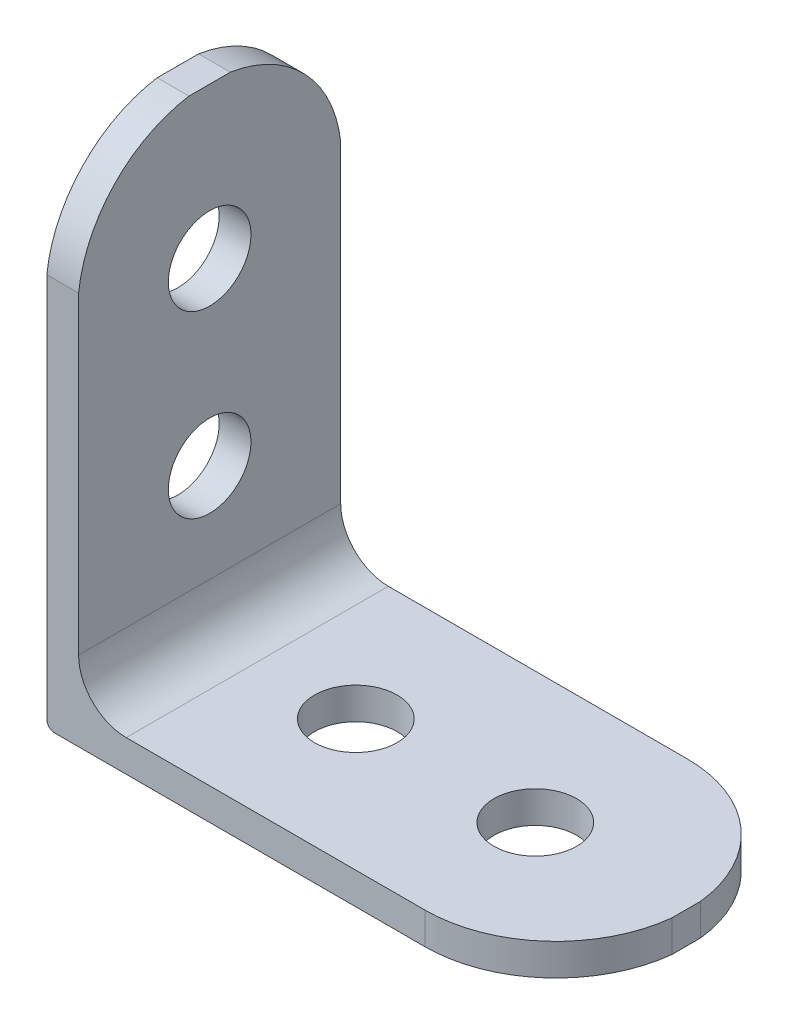
ISO-10303-21;
HEADER;
FILE_DESCRIPTION(('STEP AP214'),'2;1');
FILE_NAME('part.step','',(''),(''),'','','');
FILE_SCHEMA(('AUTOMOTIVE_DESIGN { 1 0 10303 214 1 1 1 1 }'));
ENDSEC;
DATA;
#1=APPLICATION_CONTEXT('core data for automotive mechanical design processes');
#2=APPLICATION_PROTOCOL_DEFINITION('international standard','automotive_design',2000,#1);
#3=PRODUCT_CONTEXT('',#1,'mechanical');
#4=PRODUCT('Part','Part','',(#3));
#5=PRODUCT_RELATED_PRODUCT_CATEGORY('part','',(#4));
#6=PRODUCT_DEFINITION_FORMATION('','',#4);
#7=PRODUCT_DEFINITION_CONTEXT('part definition',#1,'design');
#8=PRODUCT_DEFINITION('design','',#6,#7);
#9=PRODUCT_DEFINITION_SHAPE('','',#8);
#10=(LENGTH_UNIT() NAMED_UNIT(*) SI_UNIT(.MILLI.,.METRE.));
#11=(NAMED_UNIT(*) PLANE_ANGLE_UNIT() SI_UNIT($,.RADIAN.));
#12=(NAMED_UNIT(*) SI_UNIT($,.STERADIAN.) SOLID_ANGLE_UNIT());
#13=UNCERTAINTY_MEASURE_WITH_UNIT(LENGTH_MEASURE(1.E-05),#10,'distance_accuracy_value','');
#14=(GEOMETRIC_REPRESENTATION_CONTEXT(3) GLOBAL_UNCERTAINTY_ASSIGNED_CONTEXT((#13)) GLOBAL_UNIT_ASSIGNED_CONTEXT((#10,
#11,#12)) REPRESENTATION_CONTEXT('',''));
#15=CARTESIAN_POINT('',(0.,0.,0.));
#16=DIRECTION('',(0.,0.,1.));
#17=DIRECTION('',(1.,0.,0.));
#18=AXIS2_PLACEMENT_3D('',#15,#16,#17);
#19=CARTESIAN_POINT('',(-3.75155473803946,4.45302782887253,16.5));
#20=DIRECTION('',(0.,0.,-1.));
#21=DIRECTION('',(-1.,0.,0.));
#22=AXIS2_PLACEMENT_3D('',#19,#20,#21);
#23=PLANE('',#22);
#24=DIRECTION('',(0.,1.,0.));
#25=VECTOR('',#24,1.);
#26=CARTESIAN_POINT('',(15.0484452619605,-67.0081889417592,16.5));
#27=LINE('',#26,#25);
#28=CARTESIAN_POINT('',(15.0484452619605,-0.546972171127466,16.5));
#29=VERTEX_POINT('',#28);
#30=CARTESIAN_POINT('',(15.0484452619605,1.45302782887253,16.5));
#31=VERTEX_POINT('',#30);
#32=EDGE_CURVE('E130',#29,#31,#27,.T.);
#33=ORIENTED_EDGE('',*,*,#32,.T.);
#34=DIRECTION('',(1.,0.,0.));
#35=VECTOR('',#34,1.);
#36=CARTESIAN_POINT('',(-3.75155473803946,1.45302782887253,16.5));
#37=LINE('',#36,#35);
#38=CARTESIAN_POINT('',(-3.75155473803946,1.45302782887253,16.5));
#39=VERTEX_POINT('',#38);
#40=EDGE_CURVE('E134',#39,#31,#37,.T.);
#41=ORIENTED_EDGE('',*,*,#40,.F.);
#42=CARTESIAN_POINT('',(-3.75155473803946,4.45302782887253,16.5));
#43=DIRECTION('',(0.,0.,-1.));
#44=DIRECTION('',(-1.,0.,0.));
#45=AXIS2_PLACEMENT_3D('',#42,#43,#44);
#46=CIRCLE('',#45,3.);
#47=CARTESIAN_POINT('',(-6.75155473803946,4.45302782887253,16.5));
#48=VERTEX_POINT('',#47);
#49=EDGE_CURVE('E173',#39,#48,#46,.T.);
#50=ORIENTED_EDGE('',*,*,#49,.T.);
#51=DIRECTION('',(0.,1.,0.));
#52=VECTOR('',#51,1.);
#53=CARTESIAN_POINT('',(-6.75155473803946,4.45302782887253,16.5));
#54=LINE('',#53,#52);
#55=CARTESIAN_POINT('',(-6.75155473803946,24.1872957387002,16.5));
#56=VERTEX_POINT('',#55);
#57=EDGE_CURVE('E176',#48,#56,#54,.T.);
#58=ORIENTED_EDGE('',*,*,#57,.T.);
#59=DIRECTION('',(1.,0.,0.));
#60=VECTOR('',#59,1.);
#61=CARTESIAN_POINT('',(-71.4627715086712,24.1872957387002,16.5));
#62=LINE('',#61,#60);
#63=CARTESIAN_POINT('',(-8.75155473803946,24.1872957387002,16.5));
#64=VERTEX_POINT('',#63);
#65=EDGE_CURVE('E167',#56,#64,#62,.F.);
#66=ORIENTED_EDGE('',*,*,#65,.T.);
#67=DIRECTION('',(0.,1.,0.));
#68=VECTOR('',#67,1.);
#69=CARTESIAN_POINT('',(-8.75155473803946,0.205900086731332,16.5));
#70=LINE('',#69,#68);
#71=CARTESIAN_POINT('',(-8.75155473803946,-0.0469721711274625,16.5));
#72=VERTEX_POINT('',#71);
#73=EDGE_CURVE('E180',#72,#64,#70,.T.);
#74=ORIENTED_EDGE('',*,*,#73,.F.);
#75=CARTESIAN_POINT('',(-8.25155473803946,-0.0469721711274661,16.5));
#76=DIRECTION('',(0.,0.,-1.));
#77=DIRECTION('',(-1.,0.,0.));
#78=AXIS2_PLACEMENT_3D('',#75,#76,#77);
#79=CIRCLE('',#78,0.5);
#80=CARTESIAN_POINT('',(-8.25155473803946,-0.546972171127466,16.5));
#81=VERTEX_POINT('',#80);
#82=EDGE_CURVE('E132',#81,#72,#79,.T.);
#83=ORIENTED_EDGE('',*,*,#82,.F.);
#84=DIRECTION('',(1.,0.,0.));
#85=VECTOR('',#84,1.);
#86=CARTESIAN_POINT('',(-8.25155473803946,-0.546972171127466,16.5));
#87=LINE('',#86,#85);
#88=EDGE_CURVE('E126',#81,#29,#87,.T.);
#89=ORIENTED_EDGE('',*,*,#88,.T.);
#90=EDGE_LOOP('',(#33,#41,#50,#58,#66,#74,#83,#89));
#91=FACE_BOUND('',#90,.T.);
#92=ADVANCED_FACE('F32',(#91),#23,.F.);
#93=CARTESIAN_POINT('',(-3.75155473803946,4.45302782887253,0.));
#94=DIRECTION('',(0.,0.,-1.));
#95=DIRECTION('',(-1.,0.,0.));
#96=AXIS2_PLACEMENT_3D('',#93,#94,#95);
#97=PLANE('',#96);
#98=DIRECTION('',(1.,0.,0.));
#99=VECTOR('',#98,1.);
#100=CARTESIAN_POINT('',(-3.75155473803946,1.45302782887253,0.));
#101=LINE('',#100,#99);
#102=CARTESIAN_POINT('',(-3.75155473803946,1.45302782887253,0.));
#103=VERTEX_POINT('',#102);
#104=CARTESIAN_POINT('',(15.0484452619605,1.45302782887254,0.));
#105=VERTEX_POINT('',#104);
#106=EDGE_CURVE('E177',#103,#105,#101,.T.);
#107=ORIENTED_EDGE('',*,*,#106,.T.);
#108=DIRECTION('',(0.,1.,0.));
#109=VECTOR('',#108,1.);
#110=CARTESIAN_POINT('',(15.0484452619605,-67.0081889417592,0.));
#111=LINE('',#110,#109);
#112=CARTESIAN_POINT('',(15.0484452619605,-0.546972171127466,0.));
#113=VERTEX_POINT('',#112);
#114=EDGE_CURVE('E146',#113,#105,#111,.T.);
#115=ORIENTED_EDGE('',*,*,#114,.F.);
#116=DIRECTION('',(1.,0.,0.));
#117=VECTOR('',#116,1.);
#118=CARTESIAN_POINT('',(-8.25155473803946,-0.546972171127466,0.));
#119=LINE('',#118,#117);
#120=CARTESIAN_POINT('',(-8.25155473803946,-0.546972171127466,0.));
#121=VERTEX_POINT('',#120);
#122=EDGE_CURVE('E196',#121,#113,#119,.T.);
#123=ORIENTED_EDGE('',*,*,#122,.F.);
#124=CARTESIAN_POINT('',(-8.25155473803946,-0.0469721711274661,0.));
#125=DIRECTION('',(0.,0.,-1.));
#126=DIRECTION('',(-1.,0.,0.));
#127=AXIS2_PLACEMENT_3D('',#124,#125,#126);
#128=CIRCLE('',#127,0.5);
#129=CARTESIAN_POINT('',(-8.75155473803946,-0.0469721711274625,0.));
#130=VERTEX_POINT('',#129);
#131=EDGE_CURVE('E193',#121,#130,#128,.T.);
#132=ORIENTED_EDGE('',*,*,#131,.T.);
#133=DIRECTION('',(0.,1.,0.));
#134=VECTOR('',#133,1.);
#135=CARTESIAN_POINT('',(-8.75155473803946,-0.0469721711274625,0.));
#136=LINE('',#135,#134);
#137=CARTESIAN_POINT('',(-8.75155473803946,24.1872957387002,0.));
#138=VERTEX_POINT('',#137);
#139=EDGE_CURVE('E191',#130,#138,#136,.T.);
#140=ORIENTED_EDGE('',*,*,#139,.T.);
#141=DIRECTION('',(1.,0.,0.));
#142=VECTOR('',#141,1.);
#143=CARTESIAN_POINT('',(-71.4627715086712,24.1872957387002,0.));
#144=LINE('',#143,#142);
#145=CARTESIAN_POINT('',(-6.75155473803946,24.1872957387002,0.));
#146=VERTEX_POINT('',#145);
#147=EDGE_CURVE('E11',#146,#138,#144,.F.);
#148=ORIENTED_EDGE('',*,*,#147,.F.);
#149=DIRECTION('',(0.,1.,0.));
#150=VECTOR('',#149,1.);
#151=CARTESIAN_POINT('',(-6.75155473803946,4.45302782887253,0.));
#152=LINE('',#151,#150);
#153=CARTESIAN_POINT('',(-6.75155473803946,4.45302782887253,0.));
#154=VERTEX_POINT('',#153);
#155=EDGE_CURVE('E188',#154,#146,#152,.T.);
#156=ORIENTED_EDGE('',*,*,#155,.F.);
#157=CARTESIAN_POINT('',(-3.75155473803946,4.45302782887253,0.));
#158=DIRECTION('',(0.,0.,-1.));
#159=DIRECTION('',(-1.,0.,0.));
#160=AXIS2_PLACEMENT_3D('',#157,#158,#159);
#161=CIRCLE('',#160,3.);
#162=EDGE_CURVE('E172',#103,#154,#161,.T.);
#163=ORIENTED_EDGE('',*,*,#162,.F.);
#164=EDGE_LOOP('',(#107,#115,#123,#132,#140,#148,#156,#163));
#165=FACE_BOUND('',#164,.T.);
#166=ADVANCED_FACE('F261',(#165),#97,.T.);
#167=CARTESIAN_POINT('',(-3.75155473803946,4.45302782887253,16.5));
#168=DIRECTION('',(0.,0.,-1.));
#169=DIRECTION('',(-1.,0.,0.));
#170=AXIS2_PLACEMENT_3D('',#167,#168,#169);
#171=CYLINDRICAL_SURFACE('',#170,3.);
#172=ORIENTED_EDGE('',*,*,#162,.T.);
#173=DIRECTION('',(0.,0.,-1.));
#174=VECTOR('',#173,1.);
#175=CARTESIAN_POINT('',(-6.75155473803946,4.45302782887253,16.5));
#176=LINE('',#175,#174);
#177=EDGE_CURVE('E41',#48,#154,#176,.T.);
#178=ORIENTED_EDGE('',*,*,#177,.F.);
#179=ORIENTED_EDGE('',*,*,#49,.F.);
#180=DIRECTION('',(0.,0.,-1.));
#181=VECTOR('',#180,1.);
#182=CARTESIAN_POINT('',(-3.75155473803946,1.45302782887253,16.5));
#183=LINE('',#182,#181);
#184=EDGE_CURVE('E185',#39,#103,#183,.T.);
#185=ORIENTED_EDGE('',*,*,#184,.T.);
#186=EDGE_LOOP('',(#172,#178,#179,#185));
#187=FACE_BOUND('',#186,.T.);
#188=ADVANCED_FACE('F34',(#187),#171,.F.);
#189=CARTESIAN_POINT('',(-6.75155473803946,4.45302782887253,16.5));
#190=DIRECTION('',(-1.,0.,0.));
#191=DIRECTION('',(0.,0.,1.));
#192=AXIS2_PLACEMENT_3D('',#189,#190,#191);
#193=PLANE('',#192);
#194=CARTESIAN_POINT('',(-6.75155473803946,21.9530278288725,8.25));
#195=DIRECTION('',(-1.,0.,0.));
#196=DIRECTION('',(0.,0.,1.));
#197=AXIS2_PLACEMENT_3D('',#194,#195,#196);
#198=CIRCLE('',#197,2.6);
#199=CARTESIAN_POINT('',(-6.75155473803946,21.9530278288725,10.85));
#200=VERTEX_POINT('',#199);
#201=EDGE_CURVE('E227',#200,#200,#198,.T.);
#202=ORIENTED_EDGE('',*,*,#201,.T.);
#203=EDGE_LOOP('',(#202));
#204=FACE_BOUND('',#203,.T.);
#205=CARTESIAN_POINT('',(-6.75155473803946,10.6530278288725,8.25));
#206=DIRECTION('',(-1.,0.,0.));
#207=DIRECTION('',(0.,0.,1.));
#208=AXIS2_PLACEMENT_3D('',#205,#206,#207);
#209=CIRCLE('',#208,2.6);
#210=CARTESIAN_POINT('',(-6.75155473803946,10.6530278288725,10.85));
#211=VERTEX_POINT('',#210);
#212=EDGE_CURVE('E231',#211,#211,#209,.T.);
#213=ORIENTED_EDGE('',*,*,#212,.T.);
#214=EDGE_LOOP('',(#213));
#215=FACE_BOUND('',#214,.T.);
#216=ORIENTED_EDGE('',*,*,#155,.T.);
#217=CARTESIAN_POINT('',(-6.75155473803946,23.2530278288725,8.25));
#218=DIRECTION('',(-1.,0.,0.));
#219=DIRECTION('',(0.,0.,1.));
#220=AXIS2_PLACEMENT_3D('',#217,#218,#219);
#221=CIRCLE('',#220,8.30273187133812);
#222=CARTESIAN_POINT('',(-6.75155473803946,31.4530278288725,6.94794142707257));
#223=VERTEX_POINT('',#222);
#224=EDGE_CURVE('E161',#146,#223,#221,.F.);
#225=ORIENTED_EDGE('',*,*,#224,.T.);
#226=DIRECTION('',(0.,0.,-1.));
#227=VECTOR('',#226,1.);
#228=CARTESIAN_POINT('',(-6.75155473803946,31.4530278288725,16.5));
#229=LINE('',#228,#227);
#230=CARTESIAN_POINT('',(-6.75155473803946,31.4530278288725,9.55205857292743));
#231=VERTEX_POINT('',#230);
#232=EDGE_CURVE('E211',#231,#223,#229,.T.);
#233=ORIENTED_EDGE('',*,*,#232,.F.);
#234=EDGE_CURVE('E164',#231,#56,#221,.F.);
#235=ORIENTED_EDGE('',*,*,#234,.T.);
#236=ORIENTED_EDGE('',*,*,#57,.F.);
#237=ORIENTED_EDGE('',*,*,#177,.T.);
#238=EDGE_LOOP('',(#216,#225,#233,#235,#236,#237));
#239=FACE_BOUND('',#238,.T.);
#240=ADVANCED_FACE('F264',(#204,#215,#239),#193,.F.);
#241=CARTESIAN_POINT('',(-8.75155473803946,31.4530278288725,16.5));
#242=DIRECTION('',(0.,1.,0.));
#243=DIRECTION('',(0.,0.,1.));
#244=AXIS2_PLACEMENT_3D('',#241,#242,#243);
#245=PLANE('',#244);
#246=DIRECTION('',(1.,0.,0.));
#247=VECTOR('',#246,1.);
#248=CARTESIAN_POINT('',(-71.4627715086712,31.4530278288725,9.55205857292743));
#249=LINE('',#248,#247);
#250=CARTESIAN_POINT('',(-8.75155473803946,31.4530278288725,9.55205857292743));
#251=VERTEX_POINT('',#250);
#252=EDGE_CURVE('E170',#231,#251,#249,.F.);
#253=ORIENTED_EDGE('',*,*,#252,.F.);
#254=ORIENTED_EDGE('',*,*,#232,.T.);
#255=DIRECTION('',(1.,0.,0.));
#256=VECTOR('',#255,1.);
#257=CARTESIAN_POINT('',(-71.4627715086712,31.4530278288725,6.94794142707257));
#258=LINE('',#257,#256);
#259=CARTESIAN_POINT('',(-8.75155473803946,31.4530278288725,6.94794142707257));
#260=VERTEX_POINT('',#259);
#261=EDGE_CURVE('E163',#260,#223,#258,.T.);
#262=ORIENTED_EDGE('',*,*,#261,.F.);
#263=DIRECTION('',(0.,0.,-1.));
#264=VECTOR('',#263,1.);
#265=CARTESIAN_POINT('',(-8.75155473803946,31.4530278288725,16.5));
#266=LINE('',#265,#264);
#267=EDGE_CURVE('E208',#251,#260,#266,.T.);
#268=ORIENTED_EDGE('',*,*,#267,.F.);
#269=EDGE_LOOP('',(#253,#254,#262,#268));
#270=FACE_BOUND('',#269,.T.);
#271=ADVANCED_FACE('F248',(#270),#245,.T.);
#272=CARTESIAN_POINT('',(-8.75155473803946,-0.0469721711274625,16.5));
#273=DIRECTION('',(-1.,0.,0.));
#274=DIRECTION('',(0.,0.,1.));
#275=AXIS2_PLACEMENT_3D('',#272,#273,#274);
#276=PLANE('',#275);
#277=CARTESIAN_POINT('',(-8.75155473803946,21.9530278288725,8.25));
#278=DIRECTION('',(-1.,0.,0.));
#279=DIRECTION('',(0.,0.,1.));
#280=AXIS2_PLACEMENT_3D('',#277,#278,#279);
#281=CIRCLE('',#280,2.6);
#282=CARTESIAN_POINT('',(-8.75155473803946,21.9530278288725,10.85));
#283=VERTEX_POINT('',#282);
#284=EDGE_CURVE('E234',#283,#283,#281,.T.);
#285=ORIENTED_EDGE('',*,*,#284,.F.);
#286=EDGE_LOOP('',(#285));
#287=FACE_BOUND('',#286,.T.);
#288=CARTESIAN_POINT('',(-8.75155473803946,10.6530278288725,8.25));
#289=DIRECTION('',(-1.,0.,0.));
#290=DIRECTION('',(0.,0.,1.));
#291=AXIS2_PLACEMENT_3D('',#288,#289,#290);
#292=CIRCLE('',#291,2.6);
#293=CARTESIAN_POINT('',(-8.75155473803946,10.6530278288725,10.85));
#294=VERTEX_POINT('',#293);
#295=EDGE_CURVE('E235',#294,#294,#292,.T.);
#296=ORIENTED_EDGE('',*,*,#295,.F.);
#297=EDGE_LOOP('',(#296));
#298=FACE_BOUND('',#297,.T.);
#299=CARTESIAN_POINT('',(-8.75155473803946,23.2530278288725,8.25));
#300=DIRECTION('',(-1.,0.,0.));
#301=DIRECTION('',(0.,0.,1.));
#302=AXIS2_PLACEMENT_3D('',#299,#300,#301);
#303=CIRCLE('',#302,8.30273187133812);
#304=EDGE_CURVE('E157',#260,#138,#303,.T.);
#305=ORIENTED_EDGE('',*,*,#304,.T.);
#306=ORIENTED_EDGE('',*,*,#139,.F.);
#307=DIRECTION('',(0.,0.,-1.));
#308=VECTOR('',#307,1.);
#309=CARTESIAN_POINT('',(-8.75155473803946,-0.0469721711274625,16.5));
#310=LINE('',#309,#308);
#311=EDGE_CURVE('E206',#72,#130,#310,.T.);
#312=ORIENTED_EDGE('',*,*,#311,.F.);
#313=ORIENTED_EDGE('',*,*,#73,.T.);
#314=EDGE_CURVE('E160',#64,#251,#303,.T.);
#315=ORIENTED_EDGE('',*,*,#314,.T.);
#316=ORIENTED_EDGE('',*,*,#267,.T.);
#317=EDGE_LOOP('',(#305,#306,#312,#313,#315,#316));
#318=FACE_BOUND('',#317,.T.);
#319=ADVANCED_FACE('F244',(#287,#298,#318),#276,.T.);
#320=CARTESIAN_POINT('',(-8.25155473803946,-0.0469721711274661,16.5));
#321=DIRECTION('',(0.,0.,-1.));
#322=DIRECTION('',(-1.,0.,0.));
#323=AXIS2_PLACEMENT_3D('',#320,#321,#322);
#324=CYLINDRICAL_SURFACE('',#323,0.5);
#325=ORIENTED_EDGE('',*,*,#131,.F.);
#326=DIRECTION('',(0.,0.,-1.));
#327=VECTOR('',#326,1.);
#328=CARTESIAN_POINT('',(-8.25155473803946,-0.546972171127466,16.5));
#329=LINE('',#328,#327);
#330=EDGE_CURVE('E204',#81,#121,#329,.T.);
#331=ORIENTED_EDGE('',*,*,#330,.F.);
#332=ORIENTED_EDGE('',*,*,#82,.T.);
#333=ORIENTED_EDGE('',*,*,#311,.T.);
#334=EDGE_LOOP('',(#325,#331,#332,#333));
#335=FACE_BOUND('',#334,.T.);
#336=ADVANCED_FACE('F247',(#335),#324,.T.);
#337=CARTESIAN_POINT('',(-8.25155473803946,-0.546972171127466,16.5));
#338=DIRECTION('',(0.,1.,0.));
#339=DIRECTION('',(0.,0.,1.));
#340=AXIS2_PLACEMENT_3D('',#337,#338,#339);
#341=PLANE('',#340);
#342=CARTESIAN_POINT('',(13.7484452619605,-0.546972171127466,8.25));
#343=DIRECTION('',(0.,-1.,0.));
#344=DIRECTION('',(0.,0.,-1.));
#345=AXIS2_PLACEMENT_3D('',#342,#343,#344);
#346=CIRCLE('',#345,2.6);
#347=CARTESIAN_POINT('',(13.7484452619605,-0.546972171127466,5.65));
#348=VERTEX_POINT('',#347);
#349=EDGE_CURVE('E217',#348,#348,#346,.T.);
#350=ORIENTED_EDGE('',*,*,#349,.F.);
#351=EDGE_LOOP('',(#350));
#352=FACE_BOUND('',#351,.T.);
#353=CARTESIAN_POINT('',(2.44844526196054,-0.546972171127466,8.25));
#354=DIRECTION('',(0.,-1.,0.));
#355=DIRECTION('',(0.,0.,-1.));
#356=AXIS2_PLACEMENT_3D('',#353,#354,#355);
#357=CIRCLE('',#356,2.6);
#358=CARTESIAN_POINT('',(2.44844526196054,-0.546972171127466,5.65));
#359=VERTEX_POINT('',#358);
#360=EDGE_CURVE('E222',#359,#359,#357,.T.);
#361=ORIENTED_EDGE('',*,*,#360,.F.);
#362=EDGE_LOOP('',(#361));
#363=FACE_BOUND('',#362,.T.);
#364=ORIENTED_EDGE('',*,*,#122,.T.);
#365=CARTESIAN_POINT('',(15.0484452619605,-0.546972171127466,8.25));
#366=DIRECTION('',(0.,1.,0.));
#367=DIRECTION('',(0.,0.,1.));
#368=AXIS2_PLACEMENT_3D('',#365,#366,#367);
#369=CIRCLE('',#368,8.25);
#370=CARTESIAN_POINT('',(23.2484452619605,-0.546972171127466,7.34308214263914));
#371=VERTEX_POINT('',#370);
#372=EDGE_CURVE('E143',#371,#113,#369,.T.);
#373=ORIENTED_EDGE('',*,*,#372,.F.);
#374=DIRECTION('',(0.,0.,-1.));
#375=VECTOR('',#374,1.);
#376=CARTESIAN_POINT('',(23.2484452619605,-0.546972171127466,16.5));
#377=LINE('',#376,#375);
#378=CARTESIAN_POINT('',(23.2484452619605,-0.546972171127466,9.15691785736086));
#379=VERTEX_POINT('',#378);
#380=EDGE_CURVE('E141',#379,#371,#377,.T.);
#381=ORIENTED_EDGE('',*,*,#380,.F.);
#382=EDGE_CURVE('E137',#29,#379,#369,.T.);
#383=ORIENTED_EDGE('',*,*,#382,.F.);
#384=ORIENTED_EDGE('',*,*,#88,.F.);
#385=ORIENTED_EDGE('',*,*,#330,.T.);
#386=EDGE_LOOP('',(#364,#373,#381,#383,#384,#385));
#387=FACE_BOUND('',#386,.T.);
#388=ADVANCED_FACE('F139',(#352,#363,#387),#341,.F.);
#389=CARTESIAN_POINT('',(23.2484452619605,-0.546972171127466,16.5));
#390=DIRECTION('',(-1.,0.,0.));
#391=DIRECTION('',(0.,0.,1.));
#392=AXIS2_PLACEMENT_3D('',#389,#390,#391);
#393=PLANE('',#392);
#394=DIRECTION('',(0.,0.,-1.));
#395=VECTOR('',#394,1.);
#396=CARTESIAN_POINT('',(23.2484452619605,1.45302782887253,16.5));
#397=LINE('',#396,#395);
#398=CARTESIAN_POINT('',(23.2484452619605,1.45302782887254,9.15691785736086));
#399=VERTEX_POINT('',#398);
#400=CARTESIAN_POINT('',(23.2484452619605,1.45302782887254,7.34308214263914));
#401=VERTEX_POINT('',#400);
#402=EDGE_CURVE('E201',#399,#401,#397,.T.);
#403=ORIENTED_EDGE('',*,*,#402,.F.);
#404=DIRECTION('',(0.,1.,0.));
#405=VECTOR('',#404,1.);
#406=CARTESIAN_POINT('',(23.2484452619605,-67.0081889417592,9.15691785736086));
#407=LINE('',#406,#405);
#408=EDGE_CURVE('E49',#399,#379,#407,.F.);
#409=ORIENTED_EDGE('',*,*,#408,.T.);
#410=ORIENTED_EDGE('',*,*,#380,.T.);
#411=DIRECTION('',(0.,1.,0.));
#412=VECTOR('',#411,1.);
#413=CARTESIAN_POINT('',(23.2484452619605,-67.0081889417592,7.34308214263914));
#414=LINE('',#413,#412);
#415=EDGE_CURVE('E154',#371,#401,#414,.T.);
#416=ORIENTED_EDGE('',*,*,#415,.T.);
#417=EDGE_LOOP('',(#403,#409,#410,#416));
#418=FACE_BOUND('',#417,.T.);
#419=ADVANCED_FACE('F276',(#418),#393,.F.);
#420=CARTESIAN_POINT('',(-3.75155473803946,1.45302782887253,16.5));
#421=DIRECTION('',(0.,1.,0.));
#422=DIRECTION('',(0.,0.,1.));
#423=AXIS2_PLACEMENT_3D('',#420,#421,#422);
#424=PLANE('',#423);
#425=CARTESIAN_POINT('',(13.7484452619605,1.45302782887253,8.25));
#426=DIRECTION('',(0.,1.,0.));
#427=DIRECTION('',(0.,0.,1.));
#428=AXIS2_PLACEMENT_3D('',#425,#426,#427);
#429=CIRCLE('',#428,2.6);
#430=CARTESIAN_POINT('',(13.7484452619605,1.45302782887253,10.85));
#431=VERTEX_POINT('',#430);
#432=EDGE_CURVE('E36',#431,#431,#429,.T.);
#433=ORIENTED_EDGE('',*,*,#432,.F.);
#434=EDGE_LOOP('',(#433));
#435=FACE_BOUND('',#434,.T.);
#436=CARTESIAN_POINT('',(2.44844526196054,1.45302782887253,8.25));
#437=DIRECTION('',(0.,1.,0.));
#438=DIRECTION('',(0.,0.,1.));
#439=AXIS2_PLACEMENT_3D('',#436,#437,#438);
#440=CIRCLE('',#439,2.6);
#441=CARTESIAN_POINT('',(2.44844526196054,1.45302782887253,10.85));
#442=VERTEX_POINT('',#441);
#443=EDGE_CURVE('E215',#442,#442,#440,.T.);
#444=ORIENTED_EDGE('',*,*,#443,.F.);
#445=EDGE_LOOP('',(#444));
#446=FACE_BOUND('',#445,.T.);
#447=CARTESIAN_POINT('',(15.0484452619605,1.45302782887254,8.25));
#448=DIRECTION('',(0.,1.,0.));
#449=DIRECTION('',(0.,0.,1.));
#450=AXIS2_PLACEMENT_3D('',#447,#448,#449);
#451=CIRCLE('',#450,8.25);
#452=EDGE_CURVE('E152',#105,#401,#451,.F.);
#453=ORIENTED_EDGE('',*,*,#452,.F.);
#454=ORIENTED_EDGE('',*,*,#106,.F.);
#455=ORIENTED_EDGE('',*,*,#184,.F.);
#456=ORIENTED_EDGE('',*,*,#40,.T.);
#457=EDGE_CURVE('E57',#399,#31,#451,.F.);
#458=ORIENTED_EDGE('',*,*,#457,.F.);
#459=ORIENTED_EDGE('',*,*,#402,.T.);
#460=EDGE_LOOP('',(#453,#454,#455,#456,#458,#459));
#461=FACE_BOUND('',#460,.T.);
#462=ADVANCED_FACE('F273',(#435,#446,#461),#424,.T.);
#463=CARTESIAN_POINT('',(-71.4627715086712,23.2530278288725,8.25));
#464=DIRECTION('',(1.,0.,0.));
#465=DIRECTION('',(0.,0.,-1.));
#466=AXIS2_PLACEMENT_3D('',#463,#464,#465);
#467=CYLINDRICAL_SURFACE('',#466,8.30273187133812);
#468=ORIENTED_EDGE('',*,*,#304,.F.);
#469=ORIENTED_EDGE('',*,*,#261,.T.);
#470=ORIENTED_EDGE('',*,*,#224,.F.);
#471=ORIENTED_EDGE('',*,*,#147,.T.);
#472=EDGE_LOOP('',(#468,#469,#470,#471));
#473=FACE_BOUND('',#472,.T.);
#474=ADVANCED_FACE('F259',(#473),#467,.T.);
#475=ORIENTED_EDGE('',*,*,#234,.F.);
#476=ORIENTED_EDGE('',*,*,#252,.T.);
#477=ORIENTED_EDGE('',*,*,#314,.F.);
#478=ORIENTED_EDGE('',*,*,#65,.F.);
#479=EDGE_LOOP('',(#475,#476,#477,#478));
#480=FACE_BOUND('',#479,.T.);
#481=ADVANCED_FACE('F296',(#480),#467,.T.);
#482=CARTESIAN_POINT('',(15.0484452619605,-67.0081889417592,8.25));
#483=DIRECTION('',(0.,1.,0.));
#484=DIRECTION('',(0.,0.,1.));
#485=AXIS2_PLACEMENT_3D('',#482,#483,#484);
#486=CYLINDRICAL_SURFACE('',#485,8.25);
#487=ORIENTED_EDGE('',*,*,#415,.F.);
#488=ORIENTED_EDGE('',*,*,#372,.T.);
#489=ORIENTED_EDGE('',*,*,#114,.T.);
#490=ORIENTED_EDGE('',*,*,#452,.T.);
#491=EDGE_LOOP('',(#487,#488,#489,#490));
#492=FACE_BOUND('',#491,.T.);
#493=ADVANCED_FACE('F275',(#492),#486,.T.);
#494=ORIENTED_EDGE('',*,*,#408,.F.);
#495=ORIENTED_EDGE('',*,*,#457,.T.);
#496=ORIENTED_EDGE('',*,*,#32,.F.);
#497=ORIENTED_EDGE('',*,*,#382,.T.);
#498=EDGE_LOOP('',(#494,#495,#496,#497));
#499=FACE_BOUND('',#498,.T.);
#500=ADVANCED_FACE('F145',(#499),#486,.T.);
#501=CARTESIAN_POINT('',(2.44844526196054,9.45302782887253,8.25));
#502=DIRECTION('',(0.,-1.,0.));
#503=DIRECTION('',(0.,0.,-1.));
#504=AXIS2_PLACEMENT_3D('',#501,#502,#503);
#505=CYLINDRICAL_SURFACE('',#504,2.6);
#506=ORIENTED_EDGE('',*,*,#443,.T.);
#507=EDGE_LOOP('',(#506));
#508=FACE_BOUND('',#507,.T.);
#509=ORIENTED_EDGE('',*,*,#360,.T.);
#510=EDGE_LOOP('',(#509));
#511=FACE_BOUND('',#510,.T.);
#512=ADVANCED_FACE('F299',(#508,#511),#505,.F.);
#513=CARTESIAN_POINT('',(13.7484452619605,9.45302782887253,8.25));
#514=DIRECTION('',(0.,-1.,0.));
#515=DIRECTION('',(0.,0.,-1.));
#516=AXIS2_PLACEMENT_3D('',#513,#514,#515);
#517=CYLINDRICAL_SURFACE('',#516,2.6);
#518=ORIENTED_EDGE('',*,*,#432,.T.);
#519=EDGE_LOOP('',(#518));
#520=FACE_BOUND('',#519,.T.);
#521=ORIENTED_EDGE('',*,*,#349,.T.);
#522=EDGE_LOOP('',(#521));
#523=FACE_BOUND('',#522,.T.);
#524=ADVANCED_FACE('F302',(#520,#523),#517,.F.);
#525=CARTESIAN_POINT('',(1.24844526196054,10.6530278288725,8.25));
#526=DIRECTION('',(-1.,0.,0.));
#527=DIRECTION('',(0.,0.,1.));
#528=AXIS2_PLACEMENT_3D('',#525,#526,#527);
#529=CYLINDRICAL_SURFACE('',#528,2.6);
#530=ORIENTED_EDGE('',*,*,#295,.T.);
#531=EDGE_LOOP('',(#530));
#532=FACE_BOUND('',#531,.T.);
#533=ORIENTED_EDGE('',*,*,#212,.F.);
#534=EDGE_LOOP('',(#533));
#535=FACE_BOUND('',#534,.T.);
#536=ADVANCED_FACE('F305',(#532,#535),#529,.F.);
#537=CARTESIAN_POINT('',(1.24844526196054,21.9530278288725,8.25));
#538=DIRECTION('',(-1.,0.,0.));
#539=DIRECTION('',(0.,0.,1.));
#540=AXIS2_PLACEMENT_3D('',#537,#538,#539);
#541=CYLINDRICAL_SURFACE('',#540,2.6);
#542=ORIENTED_EDGE('',*,*,#284,.T.);
#543=EDGE_LOOP('',(#542));
#544=FACE_BOUND('',#543,.T.);
#545=ORIENTED_EDGE('',*,*,#201,.F.);
#546=EDGE_LOOP('',(#545));
#547=FACE_BOUND('',#546,.T.);
#548=ADVANCED_FACE('F241',(#544,#547),#541,.F.);
#549=CLOSED_SHELL('',(#92,#166,#188,#240,#271,#319,#336,#388,#419,#462,#474,#481,#493,#500,#512,
#524,#536,#548));
#550=MANIFOLD_SOLID_BREP('B2',#549);
#551=ADVANCED_BREP_SHAPE_REPRESENTATION('',(#18,#550),#14);
#552=SHAPE_DEFINITION_REPRESENTATION(#9,#551);
ENDSEC;
END-ISO-10303-21;
